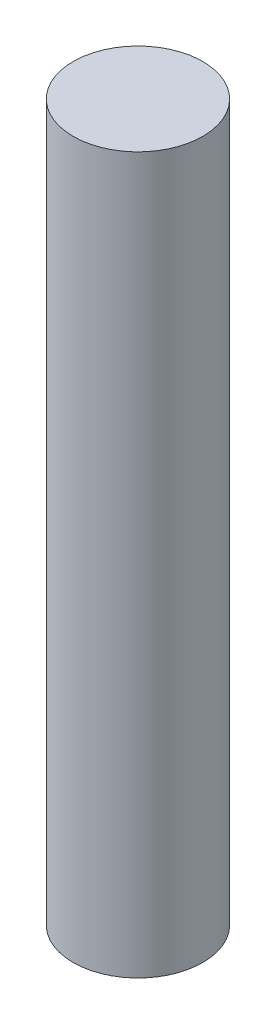
ISO-10303-21;
HEADER;
FILE_DESCRIPTION(('STEP AP214'),'2;1');
FILE_NAME('part.step','',(''),(''),'','','');
FILE_SCHEMA(('AUTOMOTIVE_DESIGN { 1 0 10303 214 1 1 1 1 }'));
ENDSEC;
DATA;
#1=APPLICATION_CONTEXT('core data for automotive mechanical design processes');
#2=APPLICATION_PROTOCOL_DEFINITION('international standard','automotive_design',2000,#1);
#3=PRODUCT_CONTEXT('',#1,'mechanical');
#4=PRODUCT('Part','Part','',(#3));
#5=PRODUCT_RELATED_PRODUCT_CATEGORY('part','',(#4));
#6=PRODUCT_DEFINITION_FORMATION('','',#4);
#7=PRODUCT_DEFINITION_CONTEXT('part definition',#1,'design');
#8=PRODUCT_DEFINITION('design','',#6,#7);
#9=PRODUCT_DEFINITION_SHAPE('','',#8);
#10=(LENGTH_UNIT() NAMED_UNIT(*) SI_UNIT(.MILLI.,.METRE.));
#11=(NAMED_UNIT(*) PLANE_ANGLE_UNIT() SI_UNIT($,.RADIAN.));
#12=(NAMED_UNIT(*) SI_UNIT($,.STERADIAN.) SOLID_ANGLE_UNIT());
#13=UNCERTAINTY_MEASURE_WITH_UNIT(LENGTH_MEASURE(1.E-05),#10,'distance_accuracy_value','');
#14=(GEOMETRIC_REPRESENTATION_CONTEXT(3) GLOBAL_UNCERTAINTY_ASSIGNED_CONTEXT((#13)) GLOBAL_UNIT_ASSIGNED_CONTEXT((#10,
#11,#12)) REPRESENTATION_CONTEXT('',''));
#15=CARTESIAN_POINT('',(0.,0.,0.));
#16=DIRECTION('',(0.,0.,1.));
#17=DIRECTION('',(1.,0.,0.));
#18=AXIS2_PLACEMENT_3D('',#15,#16,#17);
#19=CARTESIAN_POINT('',(1299.28989767983,2050.,0.));
#20=DIRECTION('',(0.,-1.,0.));
#21=DIRECTION('',(0.,0.,-1.));
#22=AXIS2_PLACEMENT_3D('',#19,#20,#21);
#23=CYLINDRICAL_SURFACE('',#22,371.577196405836);
#24=CARTESIAN_POINT('',(1299.28989767983,2050.,0.));
#25=DIRECTION('',(0.,1.,0.));
#26=DIRECTION('',(0.,0.,1.));
#27=AXIS2_PLACEMENT_3D('',#24,#25,#26);
#28=CIRCLE('',#27,371.577196405836);
#29=CARTESIAN_POINT('',(1299.28989767983,2050.,371.577196405836));
#30=VERTEX_POINT('',#29);
#31=EDGE_CURVE('E10',#30,#30,#28,.T.);
#32=ORIENTED_EDGE('',*,*,#31,.F.);
#33=EDGE_LOOP('',(#32));
#34=FACE_BOUND('',#33,.T.);
#35=CARTESIAN_POINT('',(1299.28989767983,-2050.,0.));
#36=DIRECTION('',(0.,1.,0.));
#37=DIRECTION('',(0.,0.,1.));
#38=AXIS2_PLACEMENT_3D('',#35,#36,#37);
#39=CIRCLE('',#38,371.577196405836);
#40=CARTESIAN_POINT('',(1299.28989767983,-2050.,371.577196405836));
#41=VERTEX_POINT('',#40);
#42=EDGE_CURVE('E37',#41,#41,#39,.T.);
#43=ORIENTED_EDGE('',*,*,#42,.T.);
#44=EDGE_LOOP('',(#43));
#45=FACE_BOUND('',#44,.T.);
#46=ADVANCED_FACE('F40',(#34,#45),#23,.T.);
#47=CARTESIAN_POINT('',(1299.28989767983,2050.,0.));
#48=DIRECTION('',(0.,1.,0.));
#49=DIRECTION('',(0.,0.,1.));
#50=AXIS2_PLACEMENT_3D('',#47,#48,#49);
#51=PLANE('',#50);
#52=ORIENTED_EDGE('',*,*,#31,.T.);
#53=EDGE_LOOP('',(#52));
#54=FACE_BOUND('',#53,.T.);
#55=ADVANCED_FACE('F55',(#54),#51,.T.);
#56=CARTESIAN_POINT('',(1299.28989767983,-2050.,0.));
#57=DIRECTION('',(0.,1.,0.));
#58=DIRECTION('',(0.,0.,1.));
#59=AXIS2_PLACEMENT_3D('',#56,#57,#58);
#60=PLANE('',#59);
#61=ORIENTED_EDGE('',*,*,#42,.F.);
#62=EDGE_LOOP('',(#61));
#63=FACE_BOUND('',#62,.T.);
#64=ADVANCED_FACE('F49',(#63),#60,.F.);
#65=CLOSED_SHELL('',(#46,#55,#64));
#66=MANIFOLD_SOLID_BREP('B2',#65);
#67=ADVANCED_BREP_SHAPE_REPRESENTATION('',(#18,#66),#14);
#68=SHAPE_DEFINITION_REPRESENTATION(#9,#67);
ENDSEC;
END-ISO-10303-21;
